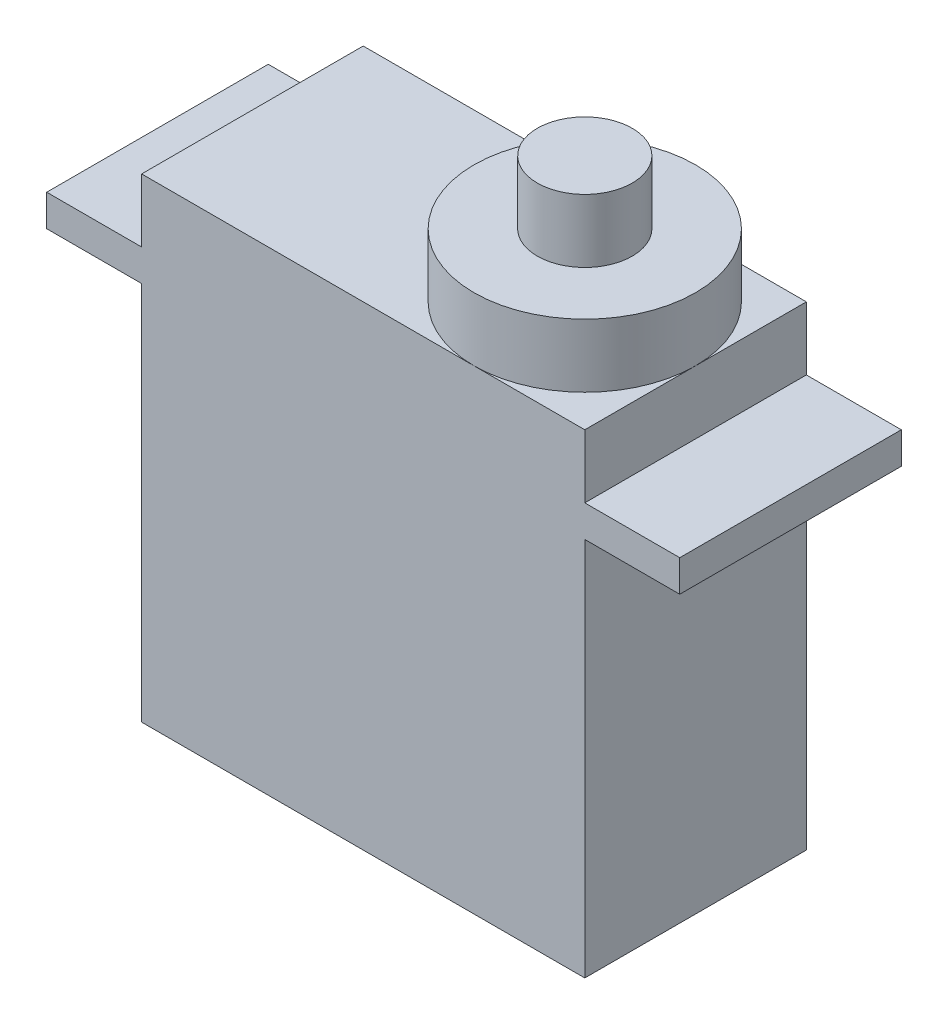
ISO-10303-21;
HEADER;
FILE_DESCRIPTION(('STEP AP214'),'2;1');
FILE_NAME('part.step','',(''),(''),'','','');
FILE_SCHEMA(('AUTOMOTIVE_DESIGN { 1 0 10303 214 1 1 1 1 }'));
ENDSEC;
DATA;
#1=APPLICATION_CONTEXT('core data for automotive mechanical design processes');
#2=APPLICATION_PROTOCOL_DEFINITION('international standard','automotive_design',2000,#1);
#3=PRODUCT_CONTEXT('',#1,'mechanical');
#4=PRODUCT('Part','Part','',(#3));
#5=PRODUCT_RELATED_PRODUCT_CATEGORY('part','',(#4));
#6=PRODUCT_DEFINITION_FORMATION('','',#4);
#7=PRODUCT_DEFINITION_CONTEXT('part definition',#1,'design');
#8=PRODUCT_DEFINITION('design','',#6,#7);
#9=PRODUCT_DEFINITION_SHAPE('','',#8);
#10=(LENGTH_UNIT() NAMED_UNIT(*) SI_UNIT(.MILLI.,.METRE.));
#11=(NAMED_UNIT(*) PLANE_ANGLE_UNIT() SI_UNIT($,.RADIAN.));
#12=(NAMED_UNIT(*) SI_UNIT($,.STERADIAN.) SOLID_ANGLE_UNIT());
#13=UNCERTAINTY_MEASURE_WITH_UNIT(LENGTH_MEASURE(1.E-05),#10,'distance_accuracy_value','');
#14=(GEOMETRIC_REPRESENTATION_CONTEXT(3) GLOBAL_UNCERTAINTY_ASSIGNED_CONTEXT((#13)) GLOBAL_UNIT_ASSIGNED_CONTEXT((#10,
#11,#12)) REPRESENTATION_CONTEXT('',''));
#15=CARTESIAN_POINT('',(0.,0.,0.));
#16=DIRECTION('',(0.,0.,1.));
#17=DIRECTION('',(1.,0.,0.));
#18=AXIS2_PLACEMENT_3D('',#15,#16,#17);
#19=CARTESIAN_POINT('',(5.55625,26.9875,0.));
#20=DIRECTION('',(0.,1.,0.));
#21=DIRECTION('',(0.,0.,1.));
#22=AXIS2_PLACEMENT_3D('',#19,#20,#21);
#23=PLANE('',#22);
#24=CARTESIAN_POINT('',(5.55625,26.9875,0.));
#25=DIRECTION('',(0.,1.,0.));
#26=DIRECTION('',(0.,0.,1.));
#27=AXIS2_PLACEMENT_3D('',#24,#25,#26);
#28=CIRCLE('',#27,5.55625);
#29=CARTESIAN_POINT('',(5.55625,26.9875,5.55625));
#30=VERTEX_POINT('',#29);
#31=EDGE_CURVE('E158',#30,#30,#28,.T.);
#32=ORIENTED_EDGE('',*,*,#31,.T.);
#33=EDGE_LOOP('',(#32));
#34=FACE_BOUND('',#33,.T.);
#35=CARTESIAN_POINT('',(5.55625,26.9875,0.));
#36=DIRECTION('',(0.,1.,0.));
#37=DIRECTION('',(0.,0.,1.));
#38=AXIS2_PLACEMENT_3D('',#35,#36,#37);
#39=CIRCLE('',#38,2.38125);
#40=CARTESIAN_POINT('',(5.55625,26.9875,2.38125));
#41=VERTEX_POINT('',#40);
#42=EDGE_CURVE('E342',#41,#41,#39,.T.);
#43=ORIENTED_EDGE('',*,*,#42,.F.);
#44=EDGE_LOOP('',(#43));
#45=FACE_BOUND('',#44,.T.);
#46=ADVANCED_FACE('F37',(#34,#45),#23,.T.);
#47=CARTESIAN_POINT('',(0.,23.8125,0.));
#48=DIRECTION('',(0.,1.,0.));
#49=DIRECTION('',(0.,0.,1.));
#50=AXIS2_PLACEMENT_3D('',#47,#48,#49);
#51=PLANE('',#50);
#52=CARTESIAN_POINT('',(5.55625,23.8125,0.));
#53=DIRECTION('',(0.,1.,0.));
#54=DIRECTION('',(0.,0.,1.));
#55=AXIS2_PLACEMENT_3D('',#52,#53,#54);
#56=CIRCLE('',#55,5.55625);
#57=CARTESIAN_POINT('',(5.55625,23.8125,5.55625));
#58=VERTEX_POINT('',#57);
#59=CARTESIAN_POINT('',(11.1125,23.8125,0.));
#60=VERTEX_POINT('',#59);
#61=EDGE_CURVE('E48',#58,#60,#56,.T.);
#62=ORIENTED_EDGE('',*,*,#61,.F.);
#63=DIRECTION('',(1.,0.,0.));
#64=VECTOR('',#63,1.);
#65=CARTESIAN_POINT('',(-11.1125,23.8125,5.55625));
#66=LINE('',#65,#64);
#67=CARTESIAN_POINT('',(11.1125,23.8125,5.55625));
#68=VERTEX_POINT('',#67);
#69=EDGE_CURVE('E143',#58,#68,#66,.T.);
#70=ORIENTED_EDGE('',*,*,#69,.T.);
#71=DIRECTION('',(0.,0.,-1.));
#72=VECTOR('',#71,1.);
#73=CARTESIAN_POINT('',(11.1125,23.8125,-5.55625));
#74=LINE('',#73,#72);
#75=EDGE_CURVE('E156',#68,#60,#74,.T.);
#76=ORIENTED_EDGE('',*,*,#75,.T.);
#77=EDGE_LOOP('',(#62,#70,#76));
#78=FACE_BOUND('',#77,.T.);
#79=ADVANCED_FACE('F155',(#78),#51,.T.);
#80=CARTESIAN_POINT('',(5.55625,23.8125,-5.55625));
#81=VERTEX_POINT('',#80);
#82=EDGE_CURVE('E11',#60,#81,#56,.T.);
#83=ORIENTED_EDGE('',*,*,#82,.F.);
#84=CARTESIAN_POINT('',(11.1125,23.8125,-5.55625));
#85=VERTEX_POINT('',#84);
#86=EDGE_CURVE('E142',#60,#85,#74,.T.);
#87=ORIENTED_EDGE('',*,*,#86,.T.);
#88=DIRECTION('',(-1.,0.,0.));
#89=VECTOR('',#88,1.);
#90=CARTESIAN_POINT('',(-11.1125,23.8125,-5.55625));
#91=LINE('',#90,#89);
#92=EDGE_CURVE('E251',#85,#81,#91,.T.);
#93=ORIENTED_EDGE('',*,*,#92,.T.);
#94=EDGE_LOOP('',(#83,#87,#93));
#95=FACE_BOUND('',#94,.T.);
#96=ADVANCED_FACE('F327',(#95),#51,.T.);
#97=CARTESIAN_POINT('',(-11.1125,23.8125,-5.55625));
#98=DIRECTION('',(1.,0.,0.));
#99=DIRECTION('',(0.,0.,-1.));
#100=AXIS2_PLACEMENT_3D('',#97,#98,#99);
#101=PLANE('',#100);
#102=DIRECTION('',(0.,-1.,0.));
#103=VECTOR('',#102,1.);
#104=CARTESIAN_POINT('',(-11.1125,23.8125,5.55625));
#105=LINE('',#104,#103);
#106=CARTESIAN_POINT('',(-11.1125,19.05,5.55625));
#107=VERTEX_POINT('',#106);
#108=CARTESIAN_POINT('',(-11.1125,0.,5.55625));
#109=VERTEX_POINT('',#108);
#110=EDGE_CURVE('E162',#107,#109,#105,.T.);
#111=ORIENTED_EDGE('',*,*,#110,.F.);
#112=DIRECTION('',(0.,0.,-1.));
#113=VECTOR('',#112,1.);
#114=CARTESIAN_POINT('',(-11.1125,19.05,5.55625));
#115=LINE('',#114,#113);
#116=CARTESIAN_POINT('',(-11.1125,19.05,-5.55625));
#117=VERTEX_POINT('',#116);
#118=EDGE_CURVE('E171',#107,#117,#115,.T.);
#119=ORIENTED_EDGE('',*,*,#118,.T.);
#120=DIRECTION('',(0.,-1.,0.));
#121=VECTOR('',#120,1.);
#122=CARTESIAN_POINT('',(-11.1125,23.8125,-5.55625));
#123=LINE('',#122,#121);
#124=CARTESIAN_POINT('',(-11.1125,0.,-5.55625));
#125=VERTEX_POINT('',#124);
#126=EDGE_CURVE('E190',#117,#125,#123,.T.);
#127=ORIENTED_EDGE('',*,*,#126,.T.);
#128=DIRECTION('',(0.,0.,1.));
#129=VECTOR('',#128,1.);
#130=CARTESIAN_POINT('',(-11.1125,0.,-5.55625));
#131=LINE('',#130,#129);
#132=EDGE_CURVE('E219',#125,#109,#131,.T.);
#133=ORIENTED_EDGE('',*,*,#132,.T.);
#134=EDGE_LOOP('',(#111,#119,#127,#133));
#135=FACE_BOUND('',#134,.T.);
#136=ADVANCED_FACE('F217',(#135),#101,.F.);
#137=CARTESIAN_POINT('',(11.1125,23.8125,-5.55625));
#138=DIRECTION('',(-1.,0.,0.));
#139=DIRECTION('',(0.,0.,1.));
#140=AXIS2_PLACEMENT_3D('',#137,#138,#139);
#141=PLANE('',#140);
#142=DIRECTION('',(0.,0.,1.));
#143=VECTOR('',#142,1.);
#144=CARTESIAN_POINT('',(11.1125,20.6375,5.55625));
#145=LINE('',#144,#143);
#146=CARTESIAN_POINT('',(11.1125,20.6375,-5.55625));
#147=VERTEX_POINT('',#146);
#148=CARTESIAN_POINT('',(11.1125,20.6375,5.55625));
#149=VERTEX_POINT('',#148);
#150=EDGE_CURVE('E261',#147,#149,#145,.T.);
#151=ORIENTED_EDGE('',*,*,#150,.F.);
#152=DIRECTION('',(0.,-1.,0.));
#153=VECTOR('',#152,1.);
#154=CARTESIAN_POINT('',(11.1125,23.8125,-5.55625));
#155=LINE('',#154,#153);
#156=EDGE_CURVE('E231',#85,#147,#155,.T.);
#157=ORIENTED_EDGE('',*,*,#156,.F.);
#158=ORIENTED_EDGE('',*,*,#86,.F.);
#159=ORIENTED_EDGE('',*,*,#75,.F.);
#160=DIRECTION('',(0.,-1.,0.));
#161=VECTOR('',#160,1.);
#162=CARTESIAN_POINT('',(11.1125,23.8125,5.55625));
#163=LINE('',#162,#161);
#164=EDGE_CURVE('E150',#68,#149,#163,.T.);
#165=ORIENTED_EDGE('',*,*,#164,.T.);
#166=EDGE_LOOP('',(#151,#157,#158,#159,#165));
#167=FACE_BOUND('',#166,.T.);
#168=ADVANCED_FACE('F399',(#167),#141,.F.);
#169=DIRECTION('',(0.,0.,-1.));
#170=VECTOR('',#169,1.);
#171=CARTESIAN_POINT('',(11.1125,19.05,5.55625));
#172=LINE('',#171,#170);
#173=CARTESIAN_POINT('',(11.1125,19.05,5.55625));
#174=VERTEX_POINT('',#173);
#175=CARTESIAN_POINT('',(11.1125,19.05,-5.55625));
#176=VERTEX_POINT('',#175);
#177=EDGE_CURVE('E195',#174,#176,#172,.T.);
#178=ORIENTED_EDGE('',*,*,#177,.F.);
#179=CARTESIAN_POINT('',(11.1125,0.,5.55625));
#180=VERTEX_POINT('',#179);
#181=EDGE_CURVE('E221',#174,#180,#163,.T.);
#182=ORIENTED_EDGE('',*,*,#181,.T.);
#183=DIRECTION('',(0.,0.,-1.));
#184=VECTOR('',#183,1.);
#185=CARTESIAN_POINT('',(11.1125,0.,-5.55625));
#186=LINE('',#185,#184);
#187=CARTESIAN_POINT('',(11.1125,0.,-5.55625));
#188=VERTEX_POINT('',#187);
#189=EDGE_CURVE('E244',#180,#188,#186,.T.);
#190=ORIENTED_EDGE('',*,*,#189,.T.);
#191=EDGE_CURVE('E235',#176,#188,#155,.T.);
#192=ORIENTED_EDGE('',*,*,#191,.F.);
#193=EDGE_LOOP('',(#178,#182,#190,#192));
#194=FACE_BOUND('',#193,.T.);
#195=ADVANCED_FACE('F293',(#194),#141,.F.);
#196=CARTESIAN_POINT('',(-11.1125,23.8125,-5.55625));
#197=VERTEX_POINT('',#196);
#198=CARTESIAN_POINT('',(-11.1125,20.6375,-5.55625000000001));
#199=VERTEX_POINT('',#198);
#200=EDGE_CURVE('E225',#197,#199,#123,.T.);
#201=ORIENTED_EDGE('',*,*,#200,.T.);
#202=DIRECTION('',(0.,0.,1.));
#203=VECTOR('',#202,1.);
#204=CARTESIAN_POINT('',(-11.1125,20.6375,5.55625));
#205=LINE('',#204,#203);
#206=CARTESIAN_POINT('',(-11.1125,20.6375,5.55625));
#207=VERTEX_POINT('',#206);
#208=EDGE_CURVE('E186',#199,#207,#205,.T.);
#209=ORIENTED_EDGE('',*,*,#208,.T.);
#210=CARTESIAN_POINT('',(-11.1125,23.8125,5.55625));
#211=VERTEX_POINT('',#210);
#212=EDGE_CURVE('E161',#211,#207,#105,.T.);
#213=ORIENTED_EDGE('',*,*,#212,.F.);
#214=DIRECTION('',(0.,0.,1.));
#215=VECTOR('',#214,1.);
#216=CARTESIAN_POINT('',(-11.1125,23.8125,-5.55625));
#217=LINE('',#216,#215);
#218=EDGE_CURVE('E138',#197,#211,#217,.T.);
#219=ORIENTED_EDGE('',*,*,#218,.F.);
#220=EDGE_LOOP('',(#201,#209,#213,#219));
#221=FACE_BOUND('',#220,.T.);
#222=ADVANCED_FACE('F39',(#221),#101,.F.);
#223=CARTESIAN_POINT('',(-11.1125,23.8125,5.55625));
#224=DIRECTION('',(0.,0.,-1.));
#225=DIRECTION('',(-1.,0.,0.));
#226=AXIS2_PLACEMENT_3D('',#223,#224,#225);
#227=PLANE('',#226);
#228=DIRECTION('',(1.,0.,0.));
#229=VECTOR('',#228,1.);
#230=CARTESIAN_POINT('',(-11.1125,0.,5.55625));
#231=LINE('',#230,#229);
#232=EDGE_CURVE('E247',#109,#180,#231,.T.);
#233=ORIENTED_EDGE('',*,*,#232,.T.);
#234=ORIENTED_EDGE('',*,*,#181,.F.);
#235=DIRECTION('',(-1.,0.,0.));
#236=VECTOR('',#235,1.);
#237=CARTESIAN_POINT('',(15.875,19.05,5.55625));
#238=LINE('',#237,#236);
#239=CARTESIAN_POINT('',(15.875,19.05,5.55625));
#240=VERTEX_POINT('',#239);
#241=EDGE_CURVE('E250',#240,#174,#238,.T.);
#242=ORIENTED_EDGE('',*,*,#241,.F.);
#243=DIRECTION('',(0.,-1.,0.));
#244=VECTOR('',#243,1.);
#245=CARTESIAN_POINT('',(15.875,20.6375,5.55625));
#246=LINE('',#245,#244);
#247=CARTESIAN_POINT('',(15.875,20.6375,5.55625));
#248=VERTEX_POINT('',#247);
#249=EDGE_CURVE('E265',#248,#240,#246,.T.);
#250=ORIENTED_EDGE('',*,*,#249,.F.);
#251=DIRECTION('',(-1.,0.,0.));
#252=VECTOR('',#251,1.);
#253=CARTESIAN_POINT('',(15.875,20.6375,5.55625));
#254=LINE('',#253,#252);
#255=EDGE_CURVE('E268',#248,#149,#254,.T.);
#256=ORIENTED_EDGE('',*,*,#255,.T.);
#257=ORIENTED_EDGE('',*,*,#164,.F.);
#258=ORIENTED_EDGE('',*,*,#69,.F.);
#259=EDGE_CURVE('E134',#211,#58,#66,.T.);
#260=ORIENTED_EDGE('',*,*,#259,.F.);
#261=ORIENTED_EDGE('',*,*,#212,.T.);
#262=DIRECTION('',(1.,0.,0.));
#263=VECTOR('',#262,1.);
#264=CARTESIAN_POINT('',(-15.875,20.6375,5.55625));
#265=LINE('',#264,#263);
#266=CARTESIAN_POINT('',(-15.875,20.6375,5.55625));
#267=VERTEX_POINT('',#266);
#268=EDGE_CURVE('E193',#267,#207,#265,.T.);
#269=ORIENTED_EDGE('',*,*,#268,.F.);
#270=DIRECTION('',(0.,-1.,0.));
#271=VECTOR('',#270,1.);
#272=CARTESIAN_POINT('',(-15.875,20.6375,5.55625));
#273=LINE('',#272,#271);
#274=CARTESIAN_POINT('',(-15.875,19.05,5.55624999999999));
#275=VERTEX_POINT('',#274);
#276=EDGE_CURVE('E167',#267,#275,#273,.T.);
#277=ORIENTED_EDGE('',*,*,#276,.T.);
#278=DIRECTION('',(1.,0.,0.));
#279=VECTOR('',#278,1.);
#280=CARTESIAN_POINT('',(-15.875,19.05,5.55624999999999));
#281=LINE('',#280,#279);
#282=EDGE_CURVE('E180',#275,#107,#281,.T.);
#283=ORIENTED_EDGE('',*,*,#282,.T.);
#284=ORIENTED_EDGE('',*,*,#110,.T.);
#285=EDGE_LOOP('',(#233,#234,#242,#250,#256,#257,#258,#260,#261,#269,#277,#283,#284));
#286=FACE_BOUND('',#285,.T.);
#287=ADVANCED_FACE('F148',(#286),#227,.F.);
#288=CARTESIAN_POINT('',(-11.1125,23.8125,-5.55625));
#289=DIRECTION('',(0.,0.,1.));
#290=DIRECTION('',(1.,0.,0.));
#291=AXIS2_PLACEMENT_3D('',#288,#289,#290);
#292=PLANE('',#291);
#293=DIRECTION('',(-1.,0.,0.));
#294=VECTOR('',#293,1.);
#295=CARTESIAN_POINT('',(-11.1125,0.,-5.55625));
#296=LINE('',#295,#294);
#297=EDGE_CURVE('E240',#188,#125,#296,.T.);
#298=ORIENTED_EDGE('',*,*,#297,.T.);
#299=ORIENTED_EDGE('',*,*,#126,.F.);
#300=DIRECTION('',(1.,0.,0.));
#301=VECTOR('',#300,1.);
#302=CARTESIAN_POINT('',(-15.875,19.05,-5.55625000000001));
#303=LINE('',#302,#301);
#304=CARTESIAN_POINT('',(-15.875,19.05,-5.55625000000001));
#305=VERTEX_POINT('',#304);
#306=EDGE_CURVE('E200',#305,#117,#303,.T.);
#307=ORIENTED_EDGE('',*,*,#306,.F.);
#308=DIRECTION('',(0.,1.,0.));
#309=VECTOR('',#308,1.);
#310=CARTESIAN_POINT('',(-15.875,20.6375,-5.55625000000001));
#311=LINE('',#310,#309);
#312=CARTESIAN_POINT('',(-15.875,20.6375,-5.55625000000001));
#313=VERTEX_POINT('',#312);
#314=EDGE_CURVE('E174',#305,#313,#311,.T.);
#315=ORIENTED_EDGE('',*,*,#314,.T.);
#316=DIRECTION('',(1.,0.,0.));
#317=VECTOR('',#316,1.);
#318=CARTESIAN_POINT('',(-15.875,20.6375,-5.55625000000001));
#319=LINE('',#318,#317);
#320=EDGE_CURVE('E196',#313,#199,#319,.T.);
#321=ORIENTED_EDGE('',*,*,#320,.T.);
#322=ORIENTED_EDGE('',*,*,#200,.F.);
#323=EDGE_CURVE('E253',#81,#197,#91,.T.);
#324=ORIENTED_EDGE('',*,*,#323,.F.);
#325=ORIENTED_EDGE('',*,*,#92,.F.);
#326=ORIENTED_EDGE('',*,*,#156,.T.);
#327=DIRECTION('',(-1.,0.,0.));
#328=VECTOR('',#327,1.);
#329=CARTESIAN_POINT('',(15.875,20.6375,-5.55625000000001));
#330=LINE('',#329,#328);
#331=CARTESIAN_POINT('',(15.875,20.6375,-5.55625000000001));
#332=VERTEX_POINT('',#331);
#333=EDGE_CURVE('E270',#332,#147,#330,.T.);
#334=ORIENTED_EDGE('',*,*,#333,.F.);
#335=DIRECTION('',(0.,1.,0.));
#336=VECTOR('',#335,1.);
#337=CARTESIAN_POINT('',(15.875,20.6375,-5.55625000000001));
#338=LINE('',#337,#336);
#339=CARTESIAN_POINT('',(15.875,19.05,-5.55625));
#340=VERTEX_POINT('',#339);
#341=EDGE_CURVE('E504',#340,#332,#338,.T.);
#342=ORIENTED_EDGE('',*,*,#341,.F.);
#343=DIRECTION('',(-1.,0.,0.));
#344=VECTOR('',#343,1.);
#345=CARTESIAN_POINT('',(15.875,19.05,-5.55625));
#346=LINE('',#345,#344);
#347=EDGE_CURVE('E275',#340,#176,#346,.T.);
#348=ORIENTED_EDGE('',*,*,#347,.T.);
#349=ORIENTED_EDGE('',*,*,#191,.T.);
#350=EDGE_LOOP('',(#298,#299,#307,#315,#321,#322,#324,#325,#326,#334,#342,#348,#349));
#351=FACE_BOUND('',#350,.T.);
#352=ADVANCED_FACE('F299',(#351),#292,.F.);
#353=EDGE_CURVE('E46',#81,#58,#56,.T.);
#354=ORIENTED_EDGE('',*,*,#353,.F.);
#355=ORIENTED_EDGE('',*,*,#323,.T.);
#356=ORIENTED_EDGE('',*,*,#218,.T.);
#357=ORIENTED_EDGE('',*,*,#259,.T.);
#358=EDGE_LOOP('',(#354,#355,#356,#357));
#359=FACE_BOUND('',#358,.T.);
#360=ADVANCED_FACE('F136',(#359),#51,.T.);
#361=CARTESIAN_POINT('',(0.,0.,0.));
#362=DIRECTION('',(0.,1.,0.));
#363=DIRECTION('',(0.,0.,1.));
#364=AXIS2_PLACEMENT_3D('',#361,#362,#363);
#365=PLANE('',#364);
#366=ORIENTED_EDGE('',*,*,#132,.F.);
#367=ORIENTED_EDGE('',*,*,#297,.F.);
#368=ORIENTED_EDGE('',*,*,#189,.F.);
#369=ORIENTED_EDGE('',*,*,#232,.F.);
#370=EDGE_LOOP('',(#366,#367,#368,#369));
#371=FACE_BOUND('',#370,.T.);
#372=ADVANCED_FACE('F298',(#371),#365,.F.);
#373=CARTESIAN_POINT('',(15.875,19.05,5.55625));
#374=DIRECTION('',(0.,1.,0.));
#375=DIRECTION('',(0.,0.,1.));
#376=AXIS2_PLACEMENT_3D('',#373,#374,#375);
#377=PLANE('',#376);
#378=ORIENTED_EDGE('',*,*,#177,.T.);
#379=ORIENTED_EDGE('',*,*,#347,.F.);
#380=DIRECTION('',(0.,0.,-1.));
#381=VECTOR('',#380,1.);
#382=CARTESIAN_POINT('',(15.875,19.05,5.55625));
#383=LINE('',#382,#381);
#384=EDGE_CURVE('E500',#240,#340,#383,.T.);
#385=ORIENTED_EDGE('',*,*,#384,.F.);
#386=ORIENTED_EDGE('',*,*,#241,.T.);
#387=EDGE_LOOP('',(#378,#379,#385,#386));
#388=FACE_BOUND('',#387,.T.);
#389=ADVANCED_FACE('F468',(#388),#377,.F.);
#390=CARTESIAN_POINT('',(15.875,20.6375,5.55625));
#391=DIRECTION('',(0.,-1.,0.));
#392=DIRECTION('',(0.,0.,-1.));
#393=AXIS2_PLACEMENT_3D('',#390,#391,#392);
#394=PLANE('',#393);
#395=ORIENTED_EDGE('',*,*,#150,.T.);
#396=ORIENTED_EDGE('',*,*,#255,.F.);
#397=DIRECTION('',(0.,0.,1.));
#398=VECTOR('',#397,1.);
#399=CARTESIAN_POINT('',(15.875,20.6375,5.55625));
#400=LINE('',#399,#398);
#401=EDGE_CURVE('E271',#332,#248,#400,.T.);
#402=ORIENTED_EDGE('',*,*,#401,.F.);
#403=ORIENTED_EDGE('',*,*,#333,.T.);
#404=EDGE_LOOP('',(#395,#396,#402,#403));
#405=FACE_BOUND('',#404,.T.);
#406=ADVANCED_FACE('F458',(#405),#394,.F.);
#407=CARTESIAN_POINT('',(15.875,0.,0.));
#408=DIRECTION('',(1.,0.,0.));
#409=DIRECTION('',(0.,1.,0.));
#410=AXIS2_PLACEMENT_3D('',#407,#408,#409);
#411=PLANE('',#410);
#412=ORIENTED_EDGE('',*,*,#249,.T.);
#413=ORIENTED_EDGE('',*,*,#384,.T.);
#414=ORIENTED_EDGE('',*,*,#341,.T.);
#415=ORIENTED_EDGE('',*,*,#401,.T.);
#416=EDGE_LOOP('',(#412,#413,#414,#415));
#417=FACE_BOUND('',#416,.T.);
#418=ADVANCED_FACE('F437',(#417),#411,.T.);
#419=CARTESIAN_POINT('',(-15.875,20.6375,5.55625));
#420=DIRECTION('',(0.,1.,0.));
#421=DIRECTION('',(0.,0.,1.));
#422=AXIS2_PLACEMENT_3D('',#419,#420,#421);
#423=PLANE('',#422);
#424=ORIENTED_EDGE('',*,*,#208,.F.);
#425=ORIENTED_EDGE('',*,*,#320,.F.);
#426=DIRECTION('',(0.,0.,1.));
#427=VECTOR('',#426,1.);
#428=CARTESIAN_POINT('',(-15.875,20.6375,5.55625));
#429=LINE('',#428,#427);
#430=EDGE_CURVE('E170',#313,#267,#429,.T.);
#431=ORIENTED_EDGE('',*,*,#430,.T.);
#432=ORIENTED_EDGE('',*,*,#268,.T.);
#433=EDGE_LOOP('',(#424,#425,#431,#432));
#434=FACE_BOUND('',#433,.T.);
#435=ADVANCED_FACE('F308',(#434),#423,.T.);
#436=CARTESIAN_POINT('',(-15.875,19.05,5.55624999999999));
#437=DIRECTION('',(0.,-1.,0.));
#438=DIRECTION('',(0.,0.,-1.));
#439=AXIS2_PLACEMENT_3D('',#436,#437,#438);
#440=PLANE('',#439);
#441=ORIENTED_EDGE('',*,*,#118,.F.);
#442=ORIENTED_EDGE('',*,*,#282,.F.);
#443=DIRECTION('',(0.,0.,-1.));
#444=VECTOR('',#443,1.);
#445=CARTESIAN_POINT('',(-15.875,19.05,5.55624999999999));
#446=LINE('',#445,#444);
#447=EDGE_CURVE('E177',#275,#305,#446,.T.);
#448=ORIENTED_EDGE('',*,*,#447,.T.);
#449=ORIENTED_EDGE('',*,*,#306,.T.);
#450=EDGE_LOOP('',(#441,#442,#448,#449));
#451=FACE_BOUND('',#450,.T.);
#452=ADVANCED_FACE('F213',(#451),#440,.T.);
#453=CARTESIAN_POINT('',(-15.875,0.,0.));
#454=DIRECTION('',(-1.,0.,0.));
#455=DIRECTION('',(0.,1.,0.));
#456=AXIS2_PLACEMENT_3D('',#453,#454,#455);
#457=PLANE('',#456);
#458=ORIENTED_EDGE('',*,*,#276,.F.);
#459=ORIENTED_EDGE('',*,*,#430,.F.);
#460=ORIENTED_EDGE('',*,*,#314,.F.);
#461=ORIENTED_EDGE('',*,*,#447,.F.);
#462=EDGE_LOOP('',(#458,#459,#460,#461));
#463=FACE_BOUND('',#462,.T.);
#464=ADVANCED_FACE('F310',(#463),#457,.T.);
#465=CARTESIAN_POINT('',(5.55625,26.9875,0.));
#466=DIRECTION('',(0.,-1.,0.));
#467=DIRECTION('',(0.,0.,-1.));
#468=AXIS2_PLACEMENT_3D('',#465,#466,#467);
#469=CYLINDRICAL_SURFACE('',#468,5.55625);
#470=ORIENTED_EDGE('',*,*,#31,.F.);
#471=EDGE_LOOP('',(#470));
#472=FACE_BOUND('',#471,.T.);
#473=ORIENTED_EDGE('',*,*,#61,.T.);
#474=ORIENTED_EDGE('',*,*,#82,.T.);
#475=ORIENTED_EDGE('',*,*,#353,.T.);
#476=EDGE_LOOP('',(#473,#474,#475));
#477=FACE_BOUND('',#476,.T.);
#478=ADVANCED_FACE('F160',(#472,#477),#469,.T.);
#479=CARTESIAN_POINT('',(5.55625,30.1625,0.));
#480=DIRECTION('',(0.,-1.,0.));
#481=DIRECTION('',(0.,0.,-1.));
#482=AXIS2_PLACEMENT_3D('',#479,#480,#481);
#483=CYLINDRICAL_SURFACE('',#482,2.38125);
#484=CARTESIAN_POINT('',(5.55625,30.1625,0.));
#485=DIRECTION('',(0.,1.,0.));
#486=DIRECTION('',(0.,0.,1.));
#487=AXIS2_PLACEMENT_3D('',#484,#485,#486);
#488=CIRCLE('',#487,2.38125);
#489=CARTESIAN_POINT('',(5.55625,30.1625,2.38125));
#490=VERTEX_POINT('',#489);
#491=EDGE_CURVE('E159',#490,#490,#488,.T.);
#492=ORIENTED_EDGE('',*,*,#491,.F.);
#493=EDGE_LOOP('',(#492));
#494=FACE_BOUND('',#493,.T.);
#495=ORIENTED_EDGE('',*,*,#42,.T.);
#496=EDGE_LOOP('',(#495));
#497=FACE_BOUND('',#496,.T.);
#498=ADVANCED_FACE('F317',(#494,#497),#483,.T.);
#499=CARTESIAN_POINT('',(5.55625,30.1625,0.));
#500=DIRECTION('',(0.,1.,0.));
#501=DIRECTION('',(0.,0.,1.));
#502=AXIS2_PLACEMENT_3D('',#499,#500,#501);
#503=PLANE('',#502);
#504=ORIENTED_EDGE('',*,*,#491,.T.);
#505=EDGE_LOOP('',(#504));
#506=FACE_BOUND('',#505,.T.);
#507=ADVANCED_FACE('F334',(#506),#503,.T.);
#508=CLOSED_SHELL('',(#46,#79,#96,#136,#168,#195,#222,#287,#352,#360,#372,#389,#406,#418,#435,
#452,#464,#478,#498,#507));
#509=MANIFOLD_SOLID_BREP('B2',#508);
#510=ADVANCED_BREP_SHAPE_REPRESENTATION('',(#18,#509),#14);
#511=SHAPE_DEFINITION_REPRESENTATION(#9,#510);
ENDSEC;
END-ISO-10303-21;
